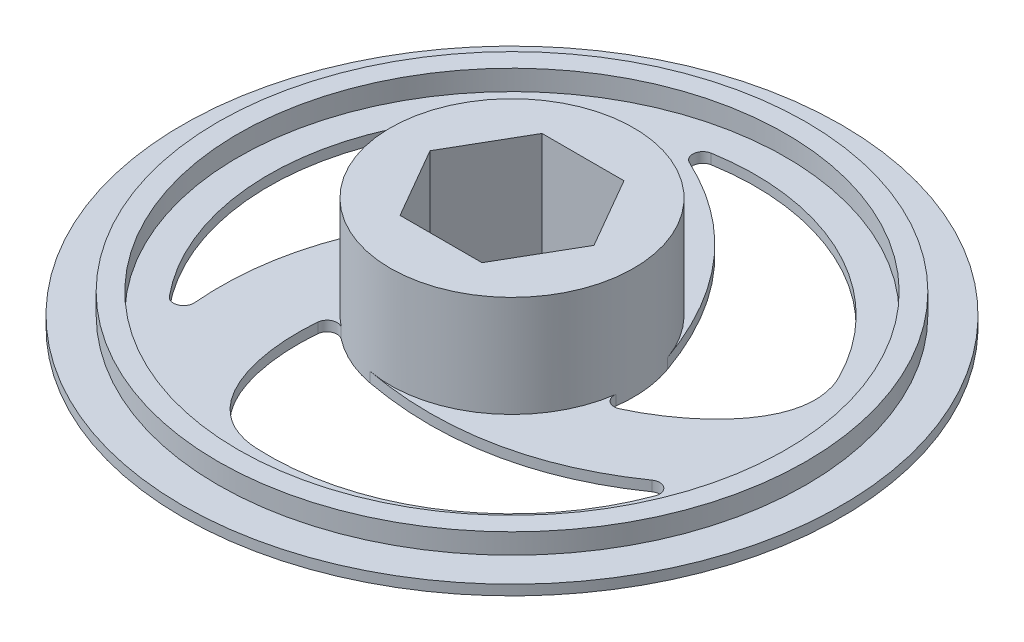
ISO-10303-21;
HEADER;
FILE_DESCRIPTION(('STEP AP214'),'2;1');
FILE_NAME('part.step','',(''),(''),'','','');
FILE_SCHEMA(('AUTOMOTIVE_DESIGN { 1 0 10303 214 1 1 1 1 }'));
ENDSEC;
DATA;
#1=APPLICATION_CONTEXT('core data for automotive mechanical design processes');
#2=APPLICATION_PROTOCOL_DEFINITION('international standard','automotive_design',2000,#1);
#3=PRODUCT_CONTEXT('',#1,'mechanical');
#4=PRODUCT('Part','Part','',(#3));
#5=PRODUCT_RELATED_PRODUCT_CATEGORY('part','',(#4));
#6=PRODUCT_DEFINITION_FORMATION('','',#4);
#7=PRODUCT_DEFINITION_CONTEXT('part definition',#1,'design');
#8=PRODUCT_DEFINITION('design','',#6,#7);
#9=PRODUCT_DEFINITION_SHAPE('','',#8);
#10=(LENGTH_UNIT() NAMED_UNIT(*) SI_UNIT(.MILLI.,.METRE.));
#11=(NAMED_UNIT(*) PLANE_ANGLE_UNIT() SI_UNIT($,.RADIAN.));
#12=(NAMED_UNIT(*) SI_UNIT($,.STERADIAN.) SOLID_ANGLE_UNIT());
#13=UNCERTAINTY_MEASURE_WITH_UNIT(LENGTH_MEASURE(1.E-05),#10,'distance_accuracy_value','');
#14=(GEOMETRIC_REPRESENTATION_CONTEXT(3) GLOBAL_UNCERTAINTY_ASSIGNED_CONTEXT((#13)) GLOBAL_UNIT_ASSIGNED_CONTEXT((#10,
#11,#12)) REPRESENTATION_CONTEXT('',''));
#15=CARTESIAN_POINT('',(0.,0.,0.));
#16=DIRECTION('',(0.,0.,1.));
#17=DIRECTION('',(1.,0.,0.));
#18=AXIS2_PLACEMENT_3D('',#15,#16,#17);
#19=CARTESIAN_POINT('',(0.,1.,0.));
#20=DIRECTION('',(0.,1.,0.));
#21=DIRECTION('',(0.,0.,1.));
#22=AXIS2_PLACEMENT_3D('',#19,#20,#21);
#23=PLANE('',#22);
#24=CARTESIAN_POINT('',(-8.69489343639183,1.,8.27035840395024));
#25=CARTESIAN_POINT('',(-9.77480690715076,1.,13.0736755082339));
#26=CARTESIAN_POINT('',(-8.87124438546541,1.,23.5659750834091));
#27=CARTESIAN_POINT('',(-1.26246524212837,1.,23.9667724467108));
#28=B_SPLINE_CURVE_WITH_KNOTS('',3,(#24,#25,#26,#27),.UNSPECIFIED.,.F.,.F.,(4,4),(0.,1.),.UNSPECIFIED.);
#29=CARTESIAN_POINT('',(-8.98473682398286,1.,10.1626556457353));
#30=VERTEX_POINT('',#29);
#31=CARTESIAN_POINT('',(-1.26246524212837,1.,23.9667724467108));
#32=VERTEX_POINT('',#31);
#33=EDGE_CURVE('E367',#30,#32,#28,.T.);
#34=ORIENTED_EDGE('',*,*,#33,.F.);
#35=CARTESIAN_POINT('',(-7.98905492211968,1.,10.2554864073508));
#36=DIRECTION('',(0.,1.,0.));
#37=DIRECTION('',(0.,0.,1.));
#38=AXIS2_PLACEMENT_3D('',#35,#36,#37);
#39=CIRCLE('',#38,1.);
#40=CARTESIAN_POINT('',(-7.37451223580273,1.,9.46660283755455));
#41=VERTEX_POINT('',#40);
#42=EDGE_CURVE('E420',#30,#41,#39,.F.);
#43=ORIENTED_EDGE('',*,*,#42,.T.);
#44=CARTESIAN_POINT('',(0.,1.,0.));
#45=DIRECTION('',(0.,1.,0.));
#46=DIRECTION('',(0.,0.,1.));
#47=AXIS2_PLACEMENT_3D('',#44,#45,#46);
#48=CIRCLE('',#47,12.);
#49=CARTESIAN_POINT('',(-9.12417481193198,1.,-7.79419232514223));
#50=VERTEX_POINT('',#49);
#51=EDGE_CURVE('E377',#50,#41,#48,.T.);
#52=ORIENTED_EDGE('',*,*,#51,.F.);
#53=CARTESIAN_POINT('',(-16.3192051709292,1.,17.5978277804142));
#54=CARTESIAN_POINT('',(-18.8195227349713,1.,3.55554676545661));
#55=CARTESIAN_POINT('',(-9.12417481193198,1.,-7.79419232514223));
#56=B_SPLINE_CURVE_WITH_KNOTS('',2,(#53,#54,#55),.UNSPECIFIED.,.F.,.F.,(3,3),(0.,1.),.UNSPECIFIED.);
#57=CARTESIAN_POINT('',(-16.7180312544519,1.,14.5843632732778));
#58=VERTEX_POINT('',#57);
#59=EDGE_CURVE('E446',#58,#50,#56,.T.);
#60=ORIENTED_EDGE('',*,*,#59,.F.);
#61=CARTESIAN_POINT('',(-17.7143817232309,1.,14.6697198393038));
#62=DIRECTION('',(0.,1.,0.));
#63=DIRECTION('',(0.,0.,1.));
#64=AXIS2_PLACEMENT_3D('',#61,#62,#63);
#65=CIRCLE('',#64,1.);
#66=CARTESIAN_POINT('',(-18.4845722329366,1.,15.3075337453605));
#67=VERTEX_POINT('',#66);
#68=EDGE_CURVE('E424',#58,#67,#65,.F.);
#69=ORIENTED_EDGE('',*,*,#68,.T.);
#70=CARTESIAN_POINT('',(0.,1.,0.));
#71=DIRECTION('',(0.,1.,0.));
#72=DIRECTION('',(0.,0.,1.));
#73=AXIS2_PLACEMENT_3D('',#70,#71,#72);
#74=CIRCLE('',#73,24.);
#75=CARTESIAN_POINT('',(-20.1246011645085,1.,-13.0767131944333));
#76=VERTEX_POINT('',#75);
#77=EDGE_CURVE('E483',#76,#67,#74,.T.);
#78=ORIENTED_EDGE('',*,*,#77,.F.);
#79=CARTESIAN_POINT('',(-0.580057571778099,1.,-11.9859723516043));
#80=CARTESIAN_POINT('',(-4.86743720434432,1.,-14.9036626374706));
#81=CARTESIAN_POINT('',(-15.696437734911,1.,-19.8915007933421));
#82=CARTESIAN_POINT('',(-20.1246011645085,1.,-13.0767131944333));
#83=B_SPLINE_CURVE_WITH_KNOTS('',3,(#79,#80,#81,#82),.UNSPECIFIED.,.F.,.F.,(4,4),(0.,1.),.UNSPECIFIED.);
#84=CARTESIAN_POINT('',(-2.95750387507128,1.,-13.4189966789089));
#85=VERTEX_POINT('',#84);
#86=EDGE_CURVE('E429',#85,#76,#83,.T.);
#87=ORIENTED_EDGE('',*,*,#86,.F.);
#88=CARTESIAN_POINT('',(-3.43206859081335,1.,-12.5387760641919));
#89=DIRECTION('',(0.,1.,0.));
#90=DIRECTION('',(0.,0.,1.));
#91=AXIS2_PLACEMENT_3D('',#88,#89,#90);
#92=CIRCLE('',#91,1.);
#93=CARTESIAN_POINT('',(-3.16806331459694,1.,-11.5742548284849));
#94=VERTEX_POINT('',#93);
#95=EDGE_CURVE('E47',#85,#94,#92,.F.);
#96=ORIENTED_EDGE('',*,*,#95,.T.);
#97=CARTESIAN_POINT('',(11.3120559615209,1.,-4.00467101313204));
#98=VERTEX_POINT('',#97);
#99=EDGE_CURVE('E373',#98,#94,#48,.T.);
#100=ORIENTED_EDGE('',*,*,#99,.F.);
#101=CARTESIAN_POINT('',(-7.08056332379757,1.,-22.9317601378022));
#102=CARTESIAN_POINT('',(6.33056754425671,1.,-18.0759581583122));
#103=CARTESIAN_POINT('',(11.3120559615209,1.,-4.00467101313204));
#104=B_SPLINE_CURVE_WITH_KNOTS('',2,(#101,#102,#103),.UNSPECIFIED.,.F.,.F.,(3,3),(0.,1.),.UNSPECIFIED.);
#105=CARTESIAN_POINT('',(-4.27141346545334,1.,-21.7704214042565));
#106=VERTEX_POINT('',#105);
#107=EDGE_CURVE('E218',#106,#98,#104,.T.);
#108=ORIENTED_EDGE('',*,*,#107,.F.);
#109=CARTESIAN_POINT('',(-3.84715918562212,1.,-22.6759645043047));
#110=DIRECTION('',(0.,1.,0.));
#111=DIRECTION('',(0.,0.,1.));
#112=AXIS2_PLACEMENT_3D('',#109,#110,#111);
#113=CIRCLE('',#112,1.);
#114=CARTESIAN_POINT('',(-4.01442697630134,1.,-23.6618760044918));
#115=VERTEX_POINT('',#114);
#116=EDGE_CURVE('E408',#106,#115,#113,.F.);
#117=ORIENTED_EDGE('',*,*,#116,.T.);
#118=CARTESIAN_POINT('',(0.,1.,0.));
#119=DIRECTION('',(0.,1.,0.));
#120=DIRECTION('',(0.,0.,1.));
#121=AXIS2_PLACEMENT_3D('',#118,#119,#120);
#122=CIRCLE('',#121,24.);
#123=CARTESIAN_POINT('',(21.3870664066367,1.,-10.8900592522775));
#124=VERTEX_POINT('',#123);
#125=EDGE_CURVE('E489',#124,#115,#122,.T.);
#126=ORIENTED_EDGE('',*,*,#125,.F.);
#127=CARTESIAN_POINT('',(11.509787194419,1.,3.39481939713872));
#128=CARTESIAN_POINT('',(16.2095385645404,1.,1.9283933445631));
#129=CARTESIAN_POINT('',(24.8443552799161,1.,-4.10026454071156));
#130=CARTESIAN_POINT('',(21.3870664066367,1.,-10.8900592522775));
#131=B_SPLINE_CURVE_WITH_KNOTS('',3,(#127,#128,#129,#130),.UNSPECIFIED.,.F.,.F.,(4,4),(0.,1.),.UNSPECIFIED.);
#132=CARTESIAN_POINT('',(13.2934863711115,1.,2.69968251301897));
#133=VERTEX_POINT('',#132);
#134=EDGE_CURVE('E463',#133,#124,#131,.T.);
#135=ORIENTED_EDGE('',*,*,#134,.F.);
#136=CARTESIAN_POINT('',(12.8760392179917,1.,1.79098131110928));
#137=DIRECTION('',(0.,1.,0.));
#138=DIRECTION('',(0.,0.,1.));
#139=AXIS2_PLACEMENT_3D('',#136,#137,#138);
#140=CIRCLE('',#139,1.);
#141=CARTESIAN_POINT('',(11.8855746627615,1.,1.65321351794702));
#142=VERTEX_POINT('',#141);
#143=EDGE_CURVE('E411',#133,#142,#140,.F.);
#144=ORIENTED_EDGE('',*,*,#143,.T.);
#145=CARTESIAN_POINT('',(-2.18788114958899,1.,11.7988633382743));
#146=VERTEX_POINT('',#145);
#147=EDGE_CURVE('E379',#146,#142,#48,.T.);
#148=ORIENTED_EDGE('',*,*,#147,.F.);
#149=CARTESIAN_POINT('',(23.3997684947268,1.,5.33393235738812));
#150=CARTESIAN_POINT('',(12.4889551907145,1.,14.5204113928557));
#151=CARTESIAN_POINT('',(-2.18788114958899,1.,11.7988633382743));
#152=B_SPLINE_CURVE_WITH_KNOTS('',2,(#149,#150,#151),.UNSPECIFIED.,.F.,.F.,(3,3),(0.,1.),.UNSPECIFIED.);
#153=CARTESIAN_POINT('',(20.9894447199052,1.,7.18605813097882));
#154=VERTEX_POINT('',#153);
#155=EDGE_CURVE('E470',#154,#146,#152,.T.);
#156=ORIENTED_EDGE('',*,*,#155,.F.);
#157=CARTESIAN_POINT('',(21.5615409088531,1.,8.00624466500103));
#158=DIRECTION('',(0.,1.,0.));
#159=DIRECTION('',(0.,0.,1.));
#160=AXIS2_PLACEMENT_3D('',#157,#158,#159);
#161=CIRCLE('',#160,1.);
#162=CARTESIAN_POINT('',(22.4989992092379,1.,8.3543422591315));
#163=VERTEX_POINT('',#162);
#164=EDGE_CURVE('E416',#154,#163,#161,.F.);
#165=ORIENTED_EDGE('',*,*,#164,.T.);
#166=CARTESIAN_POINT('',(0.,1.,0.));
#167=DIRECTION('',(0.,1.,0.));
#168=DIRECTION('',(0.,0.,1.));
#169=AXIS2_PLACEMENT_3D('',#166,#167,#168);
#170=CIRCLE('',#169,24.);
#171=EDGE_CURVE('E492',#32,#163,#170,.T.);
#172=ORIENTED_EDGE('',*,*,#171,.F.);
#173=EDGE_LOOP('',(#34,#43,#52,#60,#69,#78,#87,#96,#100,#108,#117,#126,#135,#144,#148,#156,#165,#172));
#174=FACE_BOUND('',#173,.T.);
#175=CARTESIAN_POINT('',(0.,1.,0.));
#176=DIRECTION('',(0.,1.,0.));
#177=DIRECTION('',(0.,0.,1.));
#178=AXIS2_PLACEMENT_3D('',#175,#176,#177);
#179=CIRCLE('',#178,27.);
#180=CARTESIAN_POINT('',(0.,1.,27.));
#181=VERTEX_POINT('',#180);
#182=EDGE_CURVE('E370',#181,#181,#179,.F.);
#183=ORIENTED_EDGE('',*,*,#182,.F.);
#184=EDGE_LOOP('',(#183));
#185=FACE_BOUND('',#184,.T.);
#186=ADVANCED_FACE('F39',(#174,#185),#23,.T.);
#187=CARTESIAN_POINT('',(0.,0.,0.));
#188=DIRECTION('',(0.,1.,0.));
#189=DIRECTION('',(0.,0.,1.));
#190=AXIS2_PLACEMENT_3D('',#187,#188,#189);
#191=PLANE('',#190);
#192=CARTESIAN_POINT('',(0.,0.,0.));
#193=DIRECTION('',(0.,-1.,0.));
#194=DIRECTION('',(0.,0.,1.));
#195=AXIS2_PLACEMENT_3D('',#192,#193,#194);
#196=CIRCLE('',#195,12.);
#197=CARTESIAN_POINT('',(-2.18788114958899,0.,11.7988633382743));
#198=VERTEX_POINT('',#197);
#199=CARTESIAN_POINT('',(-7.37451223580273,0.,9.46660283755455));
#200=VERTEX_POINT('',#199);
#201=EDGE_CURVE('E587',#198,#200,#196,.T.);
#202=ORIENTED_EDGE('',*,*,#201,.T.);
#203=CARTESIAN_POINT('',(-7.98905492211968,0.,10.2554864073508));
#204=DIRECTION('',(0.,1.,0.));
#205=DIRECTION('',(0.,0.,1.));
#206=AXIS2_PLACEMENT_3D('',#203,#204,#205);
#207=CIRCLE('',#206,1.);
#208=CARTESIAN_POINT('',(-8.98473682398286,0.,10.1626556457353));
#209=VERTEX_POINT('',#208);
#210=EDGE_CURVE('E422',#200,#209,#207,.T.);
#211=ORIENTED_EDGE('',*,*,#210,.T.);
#212=CARTESIAN_POINT('',(-8.69489343639183,0.,8.27035840395024));
#213=CARTESIAN_POINT('',(-9.77480690715076,0.,13.0736755082339));
#214=CARTESIAN_POINT('',(-8.87124438546541,0.,23.5659750834091));
#215=CARTESIAN_POINT('',(-1.26246524212837,0.,23.9667724467108));
#216=B_SPLINE_CURVE_WITH_KNOTS('',3,(#212,#213,#214,#215),.UNSPECIFIED.,.F.,.F.,(4,4),(0.,1.),.UNSPECIFIED.);
#217=CARTESIAN_POINT('',(-1.26246524212837,0.,23.9667724467108));
#218=VERTEX_POINT('',#217);
#219=EDGE_CURVE('E222',#209,#218,#216,.T.);
#220=ORIENTED_EDGE('',*,*,#219,.T.);
#221=CARTESIAN_POINT('',(0.,0.,0.));
#222=DIRECTION('',(0.,1.,0.));
#223=DIRECTION('',(0.,0.,1.));
#224=AXIS2_PLACEMENT_3D('',#221,#222,#223);
#225=CIRCLE('',#224,24.);
#226=CARTESIAN_POINT('',(22.4989992092379,0.,8.3543422591315));
#227=VERTEX_POINT('',#226);
#228=EDGE_CURVE('E258',#218,#227,#225,.T.);
#229=ORIENTED_EDGE('',*,*,#228,.T.);
#230=CARTESIAN_POINT('',(21.5615409088531,0.,8.00624466500103));
#231=DIRECTION('',(0.,1.,0.));
#232=DIRECTION('',(0.,0.,1.));
#233=AXIS2_PLACEMENT_3D('',#230,#231,#232);
#234=CIRCLE('',#233,1.);
#235=CARTESIAN_POINT('',(20.9894447199052,0.,7.18605813097882));
#236=VERTEX_POINT('',#235);
#237=EDGE_CURVE('E418',#227,#236,#234,.T.);
#238=ORIENTED_EDGE('',*,*,#237,.T.);
#239=CARTESIAN_POINT('',(23.3997684947268,0.,5.33393235738812));
#240=CARTESIAN_POINT('',(12.4889551907145,0.,14.5204113928557));
#241=CARTESIAN_POINT('',(-2.18788114958899,0.,11.7988633382743));
#242=B_SPLINE_CURVE_WITH_KNOTS('',2,(#239,#240,#241),.UNSPECIFIED.,.F.,.F.,(3,3),(0.,1.),.UNSPECIFIED.);
#243=EDGE_CURVE('E596',#236,#198,#242,.T.);
#244=ORIENTED_EDGE('',*,*,#243,.T.);
#245=EDGE_LOOP('',(#202,#211,#220,#229,#238,#244));
#246=FACE_BOUND('',#245,.T.);
#247=CARTESIAN_POINT('',(0.,0.,0.));
#248=DIRECTION('',(0.,-1.,0.));
#249=DIRECTION('',(0.,0.,1.));
#250=AXIS2_PLACEMENT_3D('',#247,#248,#249);
#251=CIRCLE('',#250,12.);
#252=CARTESIAN_POINT('',(11.3120559615209,0.,-4.00467101313204));
#253=VERTEX_POINT('',#252);
#254=CARTESIAN_POINT('',(11.8855746627615,0.,1.65321351794702));
#255=VERTEX_POINT('',#254);
#256=EDGE_CURVE('E204',#253,#255,#251,.T.);
#257=ORIENTED_EDGE('',*,*,#256,.T.);
#258=CARTESIAN_POINT('',(12.8760392179917,0.,1.79098131110928));
#259=DIRECTION('',(0.,1.,0.));
#260=DIRECTION('',(0.,0.,1.));
#261=AXIS2_PLACEMENT_3D('',#258,#259,#260);
#262=CIRCLE('',#261,1.);
#263=CARTESIAN_POINT('',(13.2934863711115,0.,2.69968251301897));
#264=VERTEX_POINT('',#263);
#265=EDGE_CURVE('E414',#255,#264,#262,.T.);
#266=ORIENTED_EDGE('',*,*,#265,.T.);
#267=CARTESIAN_POINT('',(11.509787194419,0.,3.39481939713872));
#268=CARTESIAN_POINT('',(16.2095385645404,0.,1.9283933445631));
#269=CARTESIAN_POINT('',(24.8443552799161,0.,-4.10026454071156));
#270=CARTESIAN_POINT('',(21.3870664066367,0.,-10.8900592522775));
#271=B_SPLINE_CURVE_WITH_KNOTS('',3,(#267,#268,#269,#270),.UNSPECIFIED.,.F.,.F.,(4,4),(0.,1.),.UNSPECIFIED.);
#272=CARTESIAN_POINT('',(21.3870664066367,0.,-10.8900592522775));
#273=VERTEX_POINT('',#272);
#274=EDGE_CURVE('E269',#264,#273,#271,.T.);
#275=ORIENTED_EDGE('',*,*,#274,.T.);
#276=CARTESIAN_POINT('',(0.,0.,0.));
#277=DIRECTION('',(0.,1.,0.));
#278=DIRECTION('',(0.,0.,1.));
#279=AXIS2_PLACEMENT_3D('',#276,#277,#278);
#280=CIRCLE('',#279,24.);
#281=CARTESIAN_POINT('',(-4.01442697630134,0.,-23.6618760044918));
#282=VERTEX_POINT('',#281);
#283=EDGE_CURVE('E212',#273,#282,#280,.T.);
#284=ORIENTED_EDGE('',*,*,#283,.T.);
#285=CARTESIAN_POINT('',(-3.84715918562212,0.,-22.6759645043047));
#286=DIRECTION('',(0.,1.,0.));
#287=DIRECTION('',(0.,0.,1.));
#288=AXIS2_PLACEMENT_3D('',#285,#286,#287);
#289=CIRCLE('',#288,1.);
#290=CARTESIAN_POINT('',(-4.27141346545334,0.,-21.7704214042565));
#291=VERTEX_POINT('',#290);
#292=EDGE_CURVE('E208',#282,#291,#289,.T.);
#293=ORIENTED_EDGE('',*,*,#292,.T.);
#294=CARTESIAN_POINT('',(-7.08056332379757,0.,-22.9317601378022));
#295=CARTESIAN_POINT('',(6.33056754425671,0.,-18.0759581583122));
#296=CARTESIAN_POINT('',(11.3120559615209,0.,-4.00467101313204));
#297=B_SPLINE_CURVE_WITH_KNOTS('',2,(#294,#295,#296),.UNSPECIFIED.,.F.,.F.,(3,3),(0.,1.),.UNSPECIFIED.);
#298=EDGE_CURVE('E200',#291,#253,#297,.T.);
#299=ORIENTED_EDGE('',*,*,#298,.T.);
#300=EDGE_LOOP('',(#257,#266,#275,#284,#293,#299));
#301=FACE_BOUND('',#300,.T.);
#302=CARTESIAN_POINT('',(0.,0.,0.));
#303=DIRECTION('',(0.,-1.,0.));
#304=DIRECTION('',(0.,0.,1.));
#305=AXIS2_PLACEMENT_3D('',#302,#303,#304);
#306=CIRCLE('',#305,12.);
#307=CARTESIAN_POINT('',(-9.12417481193198,0.,-7.79419232514223));
#308=VERTEX_POINT('',#307);
#309=CARTESIAN_POINT('',(-3.16806331459694,0.,-11.5742548284849));
#310=VERTEX_POINT('',#309);
#311=EDGE_CURVE('E432',#308,#310,#306,.T.);
#312=ORIENTED_EDGE('',*,*,#311,.T.);
#313=CARTESIAN_POINT('',(-3.43206859081335,0.,-12.5387760641919));
#314=DIRECTION('',(0.,1.,0.));
#315=DIRECTION('',(0.,0.,1.));
#316=AXIS2_PLACEMENT_3D('',#313,#314,#315);
#317=CIRCLE('',#316,1.);
#318=CARTESIAN_POINT('',(-2.95750387507128,0.,-13.4189966789089));
#319=VERTEX_POINT('',#318);
#320=EDGE_CURVE('E11',#310,#319,#317,.T.);
#321=ORIENTED_EDGE('',*,*,#320,.T.);
#322=CARTESIAN_POINT('',(-0.580057571778099,0.,-11.9859723516043));
#323=CARTESIAN_POINT('',(-4.86743720434432,0.,-14.9036626374706));
#324=CARTESIAN_POINT('',(-15.696437734911,0.,-19.8915007933421));
#325=CARTESIAN_POINT('',(-20.1246011645085,0.,-13.0767131944333));
#326=B_SPLINE_CURVE_WITH_KNOTS('',3,(#322,#323,#324,#325),.UNSPECIFIED.,.F.,.F.,(4,4),(0.,1.),.UNSPECIFIED.);
#327=CARTESIAN_POINT('',(-20.1246011645085,0.,-13.0767131944333));
#328=VERTEX_POINT('',#327);
#329=EDGE_CURVE('E260',#319,#328,#326,.T.);
#330=ORIENTED_EDGE('',*,*,#329,.T.);
#331=CARTESIAN_POINT('',(0.,0.,0.));
#332=DIRECTION('',(0.,1.,0.));
#333=DIRECTION('',(0.,0.,1.));
#334=AXIS2_PLACEMENT_3D('',#331,#332,#333);
#335=CIRCLE('',#334,24.);
#336=CARTESIAN_POINT('',(-18.4845722329366,0.,15.3075337453605));
#337=VERTEX_POINT('',#336);
#338=EDGE_CURVE('E268',#328,#337,#335,.T.);
#339=ORIENTED_EDGE('',*,*,#338,.T.);
#340=CARTESIAN_POINT('',(-17.7143817232309,0.,14.6697198393038));
#341=DIRECTION('',(0.,1.,0.));
#342=DIRECTION('',(0.,0.,1.));
#343=AXIS2_PLACEMENT_3D('',#340,#341,#342);
#344=CIRCLE('',#343,1.);
#345=CARTESIAN_POINT('',(-16.7180312544519,0.,14.5843632732778));
#346=VERTEX_POINT('',#345);
#347=EDGE_CURVE('E426',#337,#346,#344,.T.);
#348=ORIENTED_EDGE('',*,*,#347,.T.);
#349=CARTESIAN_POINT('',(-16.3192051709292,0.,17.5978277804142));
#350=CARTESIAN_POINT('',(-18.8195227349713,0.,3.55554676545661));
#351=CARTESIAN_POINT('',(-9.12417481193198,0.,-7.79419232514223));
#352=B_SPLINE_CURVE_WITH_KNOTS('',2,(#349,#350,#351),.UNSPECIFIED.,.F.,.F.,(3,3),(0.,1.),.UNSPECIFIED.);
#353=EDGE_CURVE('E435',#346,#308,#352,.T.);
#354=ORIENTED_EDGE('',*,*,#353,.T.);
#355=EDGE_LOOP('',(#312,#321,#330,#339,#348,#354));
#356=FACE_BOUND('',#355,.T.);
#357=CARTESIAN_POINT('',(0.,0.,0.));
#358=DIRECTION('',(0.,1.,0.));
#359=DIRECTION('',(0.,0.,1.));
#360=AXIS2_PLACEMENT_3D('',#357,#358,#359);
#361=CIRCLE('',#360,32.5);
#362=CARTESIAN_POINT('',(0.,0.,32.5));
#363=VERTEX_POINT('',#362);
#364=EDGE_CURVE('E381',#363,#363,#361,.T.);
#365=ORIENTED_EDGE('',*,*,#364,.F.);
#366=EDGE_LOOP('',(#365));
#367=FACE_BOUND('',#366,.T.);
#368=DIRECTION('',(-1.,0.,0.));
#369=VECTOR('',#368,1.);
#370=CARTESIAN_POINT('',(0.,0.,7.));
#371=LINE('',#370,#369);
#372=CARTESIAN_POINT('',(4.04145188432738,0.,7.));
#373=VERTEX_POINT('',#372);
#374=CARTESIAN_POINT('',(-4.04145188432739,0.,7.));
#375=VERTEX_POINT('',#374);
#376=EDGE_CURVE('E544',#373,#375,#371,.T.);
#377=ORIENTED_EDGE('',*,*,#376,.F.);
#378=DIRECTION('',(-0.5,0.,0.866025403784439));
#379=VECTOR('',#378,1.);
#380=CARTESIAN_POINT('',(6.06217782649107,0.,3.5));
#381=LINE('',#380,#379);
#382=CARTESIAN_POINT('',(8.08290376865476,0.,0.));
#383=VERTEX_POINT('',#382);
#384=EDGE_CURVE('E542',#383,#373,#381,.T.);
#385=ORIENTED_EDGE('',*,*,#384,.F.);
#386=DIRECTION('',(0.5,0.,0.866025403784439));
#387=VECTOR('',#386,1.);
#388=CARTESIAN_POINT('',(6.06217782649107,0.,-3.5));
#389=LINE('',#388,#387);
#390=CARTESIAN_POINT('',(4.04145188432738,0.,-7.));
#391=VERTEX_POINT('',#390);
#392=EDGE_CURVE('E540',#391,#383,#389,.T.);
#393=ORIENTED_EDGE('',*,*,#392,.F.);
#394=DIRECTION('',(1.,0.,0.));
#395=VECTOR('',#394,1.);
#396=CARTESIAN_POINT('',(0.,0.,-7.));
#397=LINE('',#396,#395);
#398=CARTESIAN_POINT('',(-4.04145188432738,0.,-7.));
#399=VERTEX_POINT('',#398);
#400=EDGE_CURVE('E538',#399,#391,#397,.T.);
#401=ORIENTED_EDGE('',*,*,#400,.F.);
#402=DIRECTION('',(0.5,0.,-0.866025403784439));
#403=VECTOR('',#402,1.);
#404=CARTESIAN_POINT('',(-6.06217782649107,0.,-3.5));
#405=LINE('',#404,#403);
#406=CARTESIAN_POINT('',(-8.08290376865476,0.,0.));
#407=VERTEX_POINT('',#406);
#408=EDGE_CURVE('E536',#407,#399,#405,.T.);
#409=ORIENTED_EDGE('',*,*,#408,.F.);
#410=DIRECTION('',(-0.5,0.,-0.866025403784439));
#411=VECTOR('',#410,1.);
#412=CARTESIAN_POINT('',(-6.06217782649107,0.,3.5));
#413=LINE('',#412,#411);
#414=EDGE_CURVE('E534',#375,#407,#413,.T.);
#415=ORIENTED_EDGE('',*,*,#414,.F.);
#416=EDGE_LOOP('',(#377,#385,#393,#401,#409,#415));
#417=FACE_BOUND('',#416,.T.);
#418=ADVANCED_FACE('F202',(#246,#301,#356,#367,#417),#191,.F.);
#419=CARTESIAN_POINT('',(0.,11.,0.));
#420=DIRECTION('',(0.,1.,0.));
#421=DIRECTION('',(0.,0.,1.));
#422=AXIS2_PLACEMENT_3D('',#419,#420,#421);
#423=PLANE('',#422);
#424=CARTESIAN_POINT('',(0.,11.,0.));
#425=DIRECTION('',(0.,1.,0.));
#426=DIRECTION('',(0.,0.,1.));
#427=AXIS2_PLACEMENT_3D('',#424,#425,#426);
#428=CIRCLE('',#427,12.);
#429=CARTESIAN_POINT('',(0.,11.,12.));
#430=VERTEX_POINT('',#429);
#431=EDGE_CURVE('E547',#430,#430,#428,.T.);
#432=ORIENTED_EDGE('',*,*,#431,.T.);
#433=EDGE_LOOP('',(#432));
#434=FACE_BOUND('',#433,.T.);
#435=DIRECTION('',(0.5,0.,-0.866025403784439));
#436=VECTOR('',#435,1.);
#437=CARTESIAN_POINT('',(4.04145188432738,11.,7.));
#438=LINE('',#437,#436);
#439=CARTESIAN_POINT('',(4.04145188432738,11.,7.));
#440=VERTEX_POINT('',#439);
#441=CARTESIAN_POINT('',(8.08290376865476,11.,0.));
#442=VERTEX_POINT('',#441);
#443=EDGE_CURVE('E506',#440,#442,#438,.T.);
#444=ORIENTED_EDGE('',*,*,#443,.F.);
#445=DIRECTION('',(1.,0.,0.));
#446=VECTOR('',#445,1.);
#447=CARTESIAN_POINT('',(-4.04145188432738,11.,7.));
#448=LINE('',#447,#446);
#449=CARTESIAN_POINT('',(-4.04145188432738,11.,7.));
#450=VERTEX_POINT('',#449);
#451=EDGE_CURVE('E502',#450,#440,#448,.T.);
#452=ORIENTED_EDGE('',*,*,#451,.F.);
#453=DIRECTION('',(0.5,0.,0.866025403784439));
#454=VECTOR('',#453,1.);
#455=CARTESIAN_POINT('',(-8.08290376865476,11.,0.));
#456=LINE('',#455,#454);
#457=CARTESIAN_POINT('',(-8.08290376865476,11.,0.));
#458=VERTEX_POINT('',#457);
#459=EDGE_CURVE('E515',#458,#450,#456,.T.);
#460=ORIENTED_EDGE('',*,*,#459,.F.);
#461=DIRECTION('',(-0.5,0.,0.866025403784439));
#462=VECTOR('',#461,1.);
#463=CARTESIAN_POINT('',(-4.04145188432738,11.,-7.));
#464=LINE('',#463,#462);
#465=CARTESIAN_POINT('',(-4.04145188432738,11.,-7.));
#466=VERTEX_POINT('',#465);
#467=EDGE_CURVE('E512',#466,#458,#464,.T.);
#468=ORIENTED_EDGE('',*,*,#467,.F.);
#469=DIRECTION('',(-1.,0.,0.));
#470=VECTOR('',#469,1.);
#471=CARTESIAN_POINT('',(4.04145188432738,11.,-7.));
#472=LINE('',#471,#470);
#473=CARTESIAN_POINT('',(4.04145188432738,11.,-7.));
#474=VERTEX_POINT('',#473);
#475=EDGE_CURVE('E510',#474,#466,#472,.T.);
#476=ORIENTED_EDGE('',*,*,#475,.F.);
#477=DIRECTION('',(-0.5,0.,-0.866025403784439));
#478=VECTOR('',#477,1.);
#479=CARTESIAN_POINT('',(8.08290376865476,11.,0.));
#480=LINE('',#479,#478);
#481=EDGE_CURVE('E508',#442,#474,#480,.T.);
#482=ORIENTED_EDGE('',*,*,#481,.F.);
#483=EDGE_LOOP('',(#444,#452,#460,#468,#476,#482));
#484=FACE_BOUND('',#483,.T.);
#485=ADVANCED_FACE('F319',(#434,#484),#423,.T.);
#486=CARTESIAN_POINT('',(0.,1.,0.));
#487=DIRECTION('',(0.,-1.,0.));
#488=DIRECTION('',(0.,0.,-1.));
#489=AXIS2_PLACEMENT_3D('',#486,#487,#488);
#490=CYLINDRICAL_SURFACE('',#489,32.5);
#491=CARTESIAN_POINT('',(0.,1.,0.));
#492=DIRECTION('',(0.,1.,0.));
#493=DIRECTION('',(0.,0.,1.));
#494=AXIS2_PLACEMENT_3D('',#491,#492,#493);
#495=CIRCLE('',#494,32.5);
#496=CARTESIAN_POINT('',(0.,1.,32.5));
#497=VERTEX_POINT('',#496);
#498=EDGE_CURVE('E549',#497,#497,#495,.T.);
#499=ORIENTED_EDGE('',*,*,#498,.F.);
#500=EDGE_LOOP('',(#499));
#501=FACE_BOUND('',#500,.T.);
#502=ORIENTED_EDGE('',*,*,#364,.T.);
#503=EDGE_LOOP('',(#502));
#504=FACE_BOUND('',#503,.T.);
#505=ADVANCED_FACE('F322',(#501,#504),#490,.T.);
#506=CARTESIAN_POINT('',(0.,1.,0.));
#507=DIRECTION('',(0.,1.,0.));
#508=DIRECTION('',(0.,0.,1.));
#509=AXIS2_PLACEMENT_3D('',#506,#507,#508);
#510=CIRCLE('',#509,29.);
#511=CARTESIAN_POINT('',(0.,1.,29.));
#512=VERTEX_POINT('',#511);
#513=EDGE_CURVE('E498',#512,#512,#510,.T.);
#514=ORIENTED_EDGE('',*,*,#513,.F.);
#515=EDGE_LOOP('',(#514));
#516=FACE_BOUND('',#515,.T.);
#517=ORIENTED_EDGE('',*,*,#498,.T.);
#518=EDGE_LOOP('',(#517));
#519=FACE_BOUND('',#518,.T.);
#520=ADVANCED_FACE('F326',(#516,#519),#23,.T.);
#521=CARTESIAN_POINT('',(0.,11.,0.));
#522=DIRECTION('',(0.,-1.,0.));
#523=DIRECTION('',(0.,0.,-1.));
#524=AXIS2_PLACEMENT_3D('',#521,#522,#523);
#525=CYLINDRICAL_SURFACE('',#524,12.);
#526=ORIENTED_EDGE('',*,*,#431,.F.);
#527=EDGE_LOOP('',(#526));
#528=FACE_BOUND('',#527,.T.);
#529=ORIENTED_EDGE('',*,*,#147,.T.);
#530=DIRECTION('',(0.,-1.,0.));
#531=VECTOR('',#530,1.);
#532=CARTESIAN_POINT('',(11.8855746627615,11.,1.65321351794702));
#533=LINE('',#532,#531);
#534=EDGE_CURVE('E226',#142,#255,#533,.T.);
#535=ORIENTED_EDGE('',*,*,#534,.T.);
#536=ORIENTED_EDGE('',*,*,#256,.F.);
#537=DIRECTION('',(0.,1.,0.));
#538=VECTOR('',#537,1.);
#539=CARTESIAN_POINT('',(11.3120559615209,0.,-4.00467101313204));
#540=LINE('',#539,#538);
#541=EDGE_CURVE('E215',#253,#98,#540,.T.);
#542=ORIENTED_EDGE('',*,*,#541,.T.);
#543=ORIENTED_EDGE('',*,*,#99,.T.);
#544=DIRECTION('',(0.,-1.,0.));
#545=VECTOR('',#544,1.);
#546=CARTESIAN_POINT('',(-3.16806331459694,11.,-11.5742548284849));
#547=LINE('',#546,#545);
#548=EDGE_CURVE('E388',#94,#310,#547,.T.);
#549=ORIENTED_EDGE('',*,*,#548,.T.);
#550=ORIENTED_EDGE('',*,*,#311,.F.);
#551=DIRECTION('',(0.,1.,0.));
#552=VECTOR('',#551,1.);
#553=CARTESIAN_POINT('',(-9.12417481193198,0.,-7.79419232514223));
#554=LINE('',#553,#552);
#555=EDGE_CURVE('E440',#308,#50,#554,.T.);
#556=ORIENTED_EDGE('',*,*,#555,.T.);
#557=ORIENTED_EDGE('',*,*,#51,.T.);
#558=DIRECTION('',(0.,-1.,0.));
#559=VECTOR('',#558,1.);
#560=CARTESIAN_POINT('',(-7.37451223580273,11.,9.46660283755455));
#561=LINE('',#560,#559);
#562=EDGE_CURVE('E390',#41,#200,#561,.T.);
#563=ORIENTED_EDGE('',*,*,#562,.T.);
#564=ORIENTED_EDGE('',*,*,#201,.F.);
#565=DIRECTION('',(0.,1.,0.));
#566=VECTOR('',#565,1.);
#567=CARTESIAN_POINT('',(-2.18788114958899,0.,11.7988633382743));
#568=LINE('',#567,#566);
#569=EDGE_CURVE('E592',#198,#146,#568,.T.);
#570=ORIENTED_EDGE('',*,*,#569,.T.);
#571=EDGE_LOOP('',(#529,#535,#536,#542,#543,#549,#550,#556,#557,#563,#564,#570));
#572=FACE_BOUND('',#571,.T.);
#573=ADVANCED_FACE('F224',(#528,#572),#525,.T.);
#574=CARTESIAN_POINT('',(-4.04145188432738,11.,7.));
#575=DIRECTION('',(0.,0.,-1.));
#576=DIRECTION('',(-1.,0.,0.));
#577=AXIS2_PLACEMENT_3D('',#574,#575,#576);
#578=PLANE('',#577);
#579=ORIENTED_EDGE('',*,*,#376,.T.);
#580=DIRECTION('',(0.,-1.,0.));
#581=VECTOR('',#580,1.);
#582=CARTESIAN_POINT('',(-4.04145188432738,11.,7.));
#583=LINE('',#582,#581);
#584=EDGE_CURVE('E517',#450,#375,#583,.T.);
#585=ORIENTED_EDGE('',*,*,#584,.F.);
#586=ORIENTED_EDGE('',*,*,#451,.T.);
#587=DIRECTION('',(0.,-1.,0.));
#588=VECTOR('',#587,1.);
#589=CARTESIAN_POINT('',(4.04145188432738,11.,7.));
#590=LINE('',#589,#588);
#591=EDGE_CURVE('E531',#440,#373,#590,.T.);
#592=ORIENTED_EDGE('',*,*,#591,.T.);
#593=EDGE_LOOP('',(#579,#585,#586,#592));
#594=FACE_BOUND('',#593,.T.);
#595=ADVANCED_FACE('F314',(#594),#578,.T.);
#596=CARTESIAN_POINT('',(4.04145188432738,11.,7.));
#597=DIRECTION('',(-0.866025403784439,0.,-0.5));
#598=DIRECTION('',(-0.5,0.,0.866025403784439));
#599=AXIS2_PLACEMENT_3D('',#596,#597,#598);
#600=PLANE('',#599);
#601=ORIENTED_EDGE('',*,*,#384,.T.);
#602=ORIENTED_EDGE('',*,*,#591,.F.);
#603=ORIENTED_EDGE('',*,*,#443,.T.);
#604=DIRECTION('',(0.,-1.,0.));
#605=VECTOR('',#604,1.);
#606=CARTESIAN_POINT('',(8.08290376865476,11.,0.));
#607=LINE('',#606,#605);
#608=EDGE_CURVE('E528',#442,#383,#607,.T.);
#609=ORIENTED_EDGE('',*,*,#608,.T.);
#610=EDGE_LOOP('',(#601,#602,#603,#609));
#611=FACE_BOUND('',#610,.T.);
#612=ADVANCED_FACE('F310',(#611),#600,.T.);
#613=CARTESIAN_POINT('',(8.08290376865476,11.,0.));
#614=DIRECTION('',(-0.866025403784439,0.,0.5));
#615=DIRECTION('',(0.5,0.,0.866025403784439));
#616=AXIS2_PLACEMENT_3D('',#613,#614,#615);
#617=PLANE('',#616);
#618=ORIENTED_EDGE('',*,*,#392,.T.);
#619=ORIENTED_EDGE('',*,*,#608,.F.);
#620=ORIENTED_EDGE('',*,*,#481,.T.);
#621=DIRECTION('',(0.,-1.,0.));
#622=VECTOR('',#621,1.);
#623=CARTESIAN_POINT('',(4.04145188432738,11.,-7.));
#624=LINE('',#623,#622);
#625=EDGE_CURVE('E525',#474,#391,#624,.T.);
#626=ORIENTED_EDGE('',*,*,#625,.T.);
#627=EDGE_LOOP('',(#618,#619,#620,#626));
#628=FACE_BOUND('',#627,.T.);
#629=ADVANCED_FACE('F306',(#628),#617,.T.);
#630=CARTESIAN_POINT('',(4.04145188432738,11.,-7.));
#631=DIRECTION('',(0.,0.,1.));
#632=DIRECTION('',(1.,0.,0.));
#633=AXIS2_PLACEMENT_3D('',#630,#631,#632);
#634=PLANE('',#633);
#635=ORIENTED_EDGE('',*,*,#400,.T.);
#636=ORIENTED_EDGE('',*,*,#625,.F.);
#637=ORIENTED_EDGE('',*,*,#475,.T.);
#638=DIRECTION('',(0.,-1.,0.));
#639=VECTOR('',#638,1.);
#640=CARTESIAN_POINT('',(-4.04145188432738,11.,-7.));
#641=LINE('',#640,#639);
#642=EDGE_CURVE('E522',#466,#399,#641,.T.);
#643=ORIENTED_EDGE('',*,*,#642,.T.);
#644=EDGE_LOOP('',(#635,#636,#637,#643));
#645=FACE_BOUND('',#644,.T.);
#646=ADVANCED_FACE('F302',(#645),#634,.T.);
#647=CARTESIAN_POINT('',(-4.04145188432738,11.,-7.));
#648=DIRECTION('',(0.866025403784439,0.,0.5));
#649=DIRECTION('',(0.5,0.,-0.866025403784439));
#650=AXIS2_PLACEMENT_3D('',#647,#648,#649);
#651=PLANE('',#650);
#652=ORIENTED_EDGE('',*,*,#408,.T.);
#653=ORIENTED_EDGE('',*,*,#642,.F.);
#654=ORIENTED_EDGE('',*,*,#467,.T.);
#655=DIRECTION('',(0.,-1.,0.));
#656=VECTOR('',#655,1.);
#657=CARTESIAN_POINT('',(-8.08290376865476,11.,0.));
#658=LINE('',#657,#656);
#659=EDGE_CURVE('E519',#458,#407,#658,.T.);
#660=ORIENTED_EDGE('',*,*,#659,.T.);
#661=EDGE_LOOP('',(#652,#653,#654,#660));
#662=FACE_BOUND('',#661,.T.);
#663=ADVANCED_FACE('F298',(#662),#651,.T.);
#664=CARTESIAN_POINT('',(-8.08290376865476,11.,0.));
#665=DIRECTION('',(0.866025403784439,0.,-0.5));
#666=DIRECTION('',(-0.5,0.,-0.866025403784439));
#667=AXIS2_PLACEMENT_3D('',#664,#665,#666);
#668=PLANE('',#667);
#669=ORIENTED_EDGE('',*,*,#414,.T.);
#670=ORIENTED_EDGE('',*,*,#659,.F.);
#671=ORIENTED_EDGE('',*,*,#459,.T.);
#672=ORIENTED_EDGE('',*,*,#584,.T.);
#673=EDGE_LOOP('',(#669,#670,#671,#672));
#674=FACE_BOUND('',#673,.T.);
#675=ADVANCED_FACE('F291',(#674),#668,.T.);
#676=CARTESIAN_POINT('',(0.,3.,0.));
#677=DIRECTION('',(0.,1.,0.));
#678=DIRECTION('',(0.,0.,1.));
#679=AXIS2_PLACEMENT_3D('',#676,#677,#678);
#680=PLANE('',#679);
#681=CARTESIAN_POINT('',(0.,3.,0.));
#682=DIRECTION('',(0.,1.,0.));
#683=DIRECTION('',(0.,0.,1.));
#684=AXIS2_PLACEMENT_3D('',#681,#682,#683);
#685=CIRCLE('',#684,29.);
#686=CARTESIAN_POINT('',(0.,3.,29.));
#687=VERTEX_POINT('',#686);
#688=EDGE_CURVE('E499',#687,#687,#685,.T.);
#689=ORIENTED_EDGE('',*,*,#688,.T.);
#690=EDGE_LOOP('',(#689));
#691=FACE_BOUND('',#690,.T.);
#692=CARTESIAN_POINT('',(0.,3.,0.));
#693=DIRECTION('',(0.,1.,0.));
#694=DIRECTION('',(0.,0.,1.));
#695=AXIS2_PLACEMENT_3D('',#692,#693,#694);
#696=CIRCLE('',#695,27.);
#697=CARTESIAN_POINT('',(0.,3.,27.));
#698=VERTEX_POINT('',#697);
#699=EDGE_CURVE('E495',#698,#698,#696,.T.);
#700=ORIENTED_EDGE('',*,*,#699,.F.);
#701=EDGE_LOOP('',(#700));
#702=FACE_BOUND('',#701,.T.);
#703=ADVANCED_FACE('F288',(#691,#702),#680,.T.);
#704=CARTESIAN_POINT('',(0.,3.,0.));
#705=DIRECTION('',(0.,-1.,0.));
#706=DIRECTION('',(0.,0.,-1.));
#707=AXIS2_PLACEMENT_3D('',#704,#705,#706);
#708=CYLINDRICAL_SURFACE('',#707,29.);
#709=ORIENTED_EDGE('',*,*,#688,.F.);
#710=EDGE_LOOP('',(#709));
#711=FACE_BOUND('',#710,.T.);
#712=ORIENTED_EDGE('',*,*,#513,.T.);
#713=EDGE_LOOP('',(#712));
#714=FACE_BOUND('',#713,.T.);
#715=ADVANCED_FACE('F286',(#711,#714),#708,.T.);
#716=CARTESIAN_POINT('',(0.,3.,0.));
#717=DIRECTION('',(0.,-1.,0.));
#718=DIRECTION('',(0.,0.,-1.));
#719=AXIS2_PLACEMENT_3D('',#716,#717,#718);
#720=CYLINDRICAL_SURFACE('',#719,27.);
#721=ORIENTED_EDGE('',*,*,#699,.T.);
#722=EDGE_LOOP('',(#721));
#723=FACE_BOUND('',#722,.T.);
#724=ORIENTED_EDGE('',*,*,#182,.T.);
#725=EDGE_LOOP('',(#724));
#726=FACE_BOUND('',#725,.T.);
#727=ADVANCED_FACE('F280',(#723,#726),#720,.F.);
#728=DIRECTION('',(0.,1.,0.));
#729=VECTOR('',#728,1.);
#730=SURFACE_OF_LINEAR_EXTRUSION('',#326,#729);
#731=ORIENTED_EDGE('',*,*,#329,.F.);
#732=DIRECTION('',(0.,1.,0.));
#733=VECTOR('',#732,1.);
#734=CARTESIAN_POINT('',(-2.95750387507125,0.,-13.4189966789088));
#735=LINE('',#734,#733);
#736=EDGE_CURVE('E406',#319,#85,#735,.T.);
#737=ORIENTED_EDGE('',*,*,#736,.T.);
#738=ORIENTED_EDGE('',*,*,#86,.T.);
#739=DIRECTION('',(0.,1.,0.));
#740=VECTOR('',#739,1.);
#741=CARTESIAN_POINT('',(-20.1246011645085,0.,-13.0767131944333));
#742=LINE('',#741,#740);
#743=EDGE_CURVE('E437',#328,#76,#742,.T.);
#744=ORIENTED_EDGE('',*,*,#743,.F.);
#745=EDGE_LOOP('',(#731,#737,#738,#744));
#746=FACE_BOUND('',#745,.T.);
#747=ADVANCED_FACE('F275',(#746),#730,.F.);
#748=DIRECTION('',(0.,1.,0.));
#749=VECTOR('',#748,1.);
#750=SURFACE_OF_LINEAR_EXTRUSION('',#352,#749);
#751=ORIENTED_EDGE('',*,*,#353,.F.);
#752=DIRECTION('',(0.,1.,0.));
#753=VECTOR('',#752,1.);
#754=CARTESIAN_POINT('',(-16.7180312544519,0.,14.5843632732778));
#755=LINE('',#754,#753);
#756=EDGE_CURVE('E401',#346,#58,#755,.T.);
#757=ORIENTED_EDGE('',*,*,#756,.T.);
#758=ORIENTED_EDGE('',*,*,#59,.T.);
#759=ORIENTED_EDGE('',*,*,#555,.F.);
#760=EDGE_LOOP('',(#751,#757,#758,#759));
#761=FACE_BOUND('',#760,.T.);
#762=ADVANCED_FACE('F279',(#761),#750,.F.);
#763=CARTESIAN_POINT('',(0.,0.,0.));
#764=DIRECTION('',(0.,1.,0.));
#765=DIRECTION('',(0.,0.,1.));
#766=AXIS2_PLACEMENT_3D('',#763,#764,#765);
#767=CYLINDRICAL_SURFACE('',#766,24.);
#768=ORIENTED_EDGE('',*,*,#77,.T.);
#769=DIRECTION('',(0.,1.,0.));
#770=VECTOR('',#769,1.);
#771=CARTESIAN_POINT('',(-18.4845722329366,0.,15.3075337453605));
#772=LINE('',#771,#770);
#773=EDGE_CURVE('E404',#67,#337,#772,.F.);
#774=ORIENTED_EDGE('',*,*,#773,.T.);
#775=ORIENTED_EDGE('',*,*,#338,.F.);
#776=ORIENTED_EDGE('',*,*,#743,.T.);
#777=EDGE_LOOP('',(#768,#774,#775,#776));
#778=FACE_BOUND('',#777,.T.);
#779=ADVANCED_FACE('F282',(#778),#767,.F.);
#780=DIRECTION('',(0.,1.,0.));
#781=VECTOR('',#780,1.);
#782=SURFACE_OF_LINEAR_EXTRUSION('',#271,#781);
#783=ORIENTED_EDGE('',*,*,#274,.F.);
#784=DIRECTION('',(0.,1.,0.));
#785=VECTOR('',#784,1.);
#786=CARTESIAN_POINT('',(13.2934863711115,0.,2.69968251301897));
#787=LINE('',#786,#785);
#788=EDGE_CURVE('E385',#264,#133,#787,.T.);
#789=ORIENTED_EDGE('',*,*,#788,.T.);
#790=ORIENTED_EDGE('',*,*,#134,.T.);
#791=DIRECTION('',(0.,1.,0.));
#792=VECTOR('',#791,1.);
#793=CARTESIAN_POINT('',(21.3870664066367,0.,-10.8900592522775));
#794=LINE('',#793,#792);
#795=EDGE_CURVE('E221',#273,#124,#794,.T.);
#796=ORIENTED_EDGE('',*,*,#795,.F.);
#797=EDGE_LOOP('',(#783,#789,#790,#796));
#798=FACE_BOUND('',#797,.T.);
#799=ADVANCED_FACE('F243',(#798),#782,.F.);
#800=DIRECTION('',(0.,1.,0.));
#801=VECTOR('',#800,1.);
#802=SURFACE_OF_LINEAR_EXTRUSION('',#297,#801);
#803=ORIENTED_EDGE('',*,*,#298,.F.);
#804=DIRECTION('',(0.,1.,0.));
#805=VECTOR('',#804,1.);
#806=CARTESIAN_POINT('',(-4.27141346545334,0.,-21.7704214042565));
#807=LINE('',#806,#805);
#808=EDGE_CURVE('E372',#291,#106,#807,.T.);
#809=ORIENTED_EDGE('',*,*,#808,.T.);
#810=ORIENTED_EDGE('',*,*,#107,.T.);
#811=ORIENTED_EDGE('',*,*,#541,.F.);
#812=EDGE_LOOP('',(#803,#809,#810,#811));
#813=FACE_BOUND('',#812,.T.);
#814=ADVANCED_FACE('F216',(#813),#802,.F.);
#815=CARTESIAN_POINT('',(0.,0.,0.));
#816=DIRECTION('',(0.,1.,0.));
#817=DIRECTION('',(0.,0.,1.));
#818=AXIS2_PLACEMENT_3D('',#815,#816,#817);
#819=CYLINDRICAL_SURFACE('',#818,24.);
#820=ORIENTED_EDGE('',*,*,#125,.T.);
#821=DIRECTION('',(0.,1.,0.));
#822=VECTOR('',#821,1.);
#823=CARTESIAN_POINT('',(-4.01442697630134,0.,-23.6618760044918));
#824=LINE('',#823,#822);
#825=EDGE_CURVE('E375',#115,#282,#824,.F.);
#826=ORIENTED_EDGE('',*,*,#825,.T.);
#827=ORIENTED_EDGE('',*,*,#283,.F.);
#828=ORIENTED_EDGE('',*,*,#795,.T.);
#829=EDGE_LOOP('',(#820,#826,#827,#828));
#830=FACE_BOUND('',#829,.T.);
#831=ADVANCED_FACE('F242',(#830),#819,.F.);
#832=DIRECTION('',(0.,1.,0.));
#833=VECTOR('',#832,1.);
#834=SURFACE_OF_LINEAR_EXTRUSION('',#216,#833);
#835=ORIENTED_EDGE('',*,*,#219,.F.);
#836=DIRECTION('',(0.,1.,0.));
#837=VECTOR('',#836,1.);
#838=CARTESIAN_POINT('',(-8.98473682398286,0.,10.1626556457353));
#839=LINE('',#838,#837);
#840=EDGE_CURVE('E398',#209,#30,#839,.T.);
#841=ORIENTED_EDGE('',*,*,#840,.T.);
#842=ORIENTED_EDGE('',*,*,#33,.T.);
#843=DIRECTION('',(0.,1.,0.));
#844=VECTOR('',#843,1.);
#845=CARTESIAN_POINT('',(-1.26246524212837,0.,23.9667724467108));
#846=LINE('',#845,#844);
#847=EDGE_CURVE('E589',#218,#32,#846,.T.);
#848=ORIENTED_EDGE('',*,*,#847,.F.);
#849=EDGE_LOOP('',(#835,#841,#842,#848));
#850=FACE_BOUND('',#849,.T.);
#851=ADVANCED_FACE('F245',(#850),#834,.F.);
#852=DIRECTION('',(0.,1.,0.));
#853=VECTOR('',#852,1.);
#854=SURFACE_OF_LINEAR_EXTRUSION('',#242,#853);
#855=ORIENTED_EDGE('',*,*,#243,.F.);
#856=DIRECTION('',(0.,1.,0.));
#857=VECTOR('',#856,1.);
#858=CARTESIAN_POINT('',(20.9894447199052,0.,7.18605813097882));
#859=LINE('',#858,#857);
#860=EDGE_CURVE('E393',#236,#154,#859,.T.);
#861=ORIENTED_EDGE('',*,*,#860,.T.);
#862=ORIENTED_EDGE('',*,*,#155,.T.);
#863=ORIENTED_EDGE('',*,*,#569,.F.);
#864=EDGE_LOOP('',(#855,#861,#862,#863));
#865=FACE_BOUND('',#864,.T.);
#866=ADVANCED_FACE('F249',(#865),#854,.F.);
#867=CARTESIAN_POINT('',(0.,0.,0.));
#868=DIRECTION('',(0.,1.,0.));
#869=DIRECTION('',(0.,0.,1.));
#870=AXIS2_PLACEMENT_3D('',#867,#868,#869);
#871=CYLINDRICAL_SURFACE('',#870,24.);
#872=ORIENTED_EDGE('',*,*,#171,.T.);
#873=DIRECTION('',(0.,1.,0.));
#874=VECTOR('',#873,1.);
#875=CARTESIAN_POINT('',(22.4989992092379,0.,8.3543422591315));
#876=LINE('',#875,#874);
#877=EDGE_CURVE('E396',#163,#227,#876,.F.);
#878=ORIENTED_EDGE('',*,*,#877,.T.);
#879=ORIENTED_EDGE('',*,*,#228,.F.);
#880=ORIENTED_EDGE('',*,*,#847,.T.);
#881=EDGE_LOOP('',(#872,#878,#879,#880));
#882=FACE_BOUND('',#881,.T.);
#883=ADVANCED_FACE('F251',(#882),#871,.F.);
#884=CARTESIAN_POINT('',(-3.84715918562212,0.5,-22.6759645043047));
#885=DIRECTION('',(0.,1.,0.));
#886=DIRECTION('',(0.,0.,1.));
#887=AXIS2_PLACEMENT_3D('',#884,#885,#886);
#888=CYLINDRICAL_SURFACE('',#887,1.);
#889=ORIENTED_EDGE('',*,*,#292,.F.);
#890=ORIENTED_EDGE('',*,*,#825,.F.);
#891=ORIENTED_EDGE('',*,*,#116,.F.);
#892=ORIENTED_EDGE('',*,*,#808,.F.);
#893=EDGE_LOOP('',(#889,#890,#891,#892));
#894=FACE_BOUND('',#893,.T.);
#895=ADVANCED_FACE('F337',(#894),#888,.F.);
#896=CARTESIAN_POINT('',(12.8760392179917,0.5,1.79098131110928));
#897=DIRECTION('',(0.,1.,0.));
#898=DIRECTION('',(0.,0.,1.));
#899=AXIS2_PLACEMENT_3D('',#896,#897,#898);
#900=CYLINDRICAL_SURFACE('',#899,1.);
#901=ORIENTED_EDGE('',*,*,#265,.F.);
#902=ORIENTED_EDGE('',*,*,#534,.F.);
#903=ORIENTED_EDGE('',*,*,#143,.F.);
#904=ORIENTED_EDGE('',*,*,#788,.F.);
#905=EDGE_LOOP('',(#901,#902,#903,#904));
#906=FACE_BOUND('',#905,.T.);
#907=ADVANCED_FACE('F340',(#906),#900,.F.);
#908=CARTESIAN_POINT('',(21.5615409088531,0.5,8.00624466500103));
#909=DIRECTION('',(0.,1.,0.));
#910=DIRECTION('',(0.,0.,1.));
#911=AXIS2_PLACEMENT_3D('',#908,#909,#910);
#912=CYLINDRICAL_SURFACE('',#911,1.);
#913=ORIENTED_EDGE('',*,*,#237,.F.);
#914=ORIENTED_EDGE('',*,*,#877,.F.);
#915=ORIENTED_EDGE('',*,*,#164,.F.);
#916=ORIENTED_EDGE('',*,*,#860,.F.);
#917=EDGE_LOOP('',(#913,#914,#915,#916));
#918=FACE_BOUND('',#917,.T.);
#919=ADVANCED_FACE('F344',(#918),#912,.F.);
#920=CARTESIAN_POINT('',(-7.98905492211968,0.5,10.2554864073508));
#921=DIRECTION('',(0.,1.,0.));
#922=DIRECTION('',(0.,0.,1.));
#923=AXIS2_PLACEMENT_3D('',#920,#921,#922);
#924=CYLINDRICAL_SURFACE('',#923,1.);
#925=ORIENTED_EDGE('',*,*,#210,.F.);
#926=ORIENTED_EDGE('',*,*,#562,.F.);
#927=ORIENTED_EDGE('',*,*,#42,.F.);
#928=ORIENTED_EDGE('',*,*,#840,.F.);
#929=EDGE_LOOP('',(#925,#926,#927,#928));
#930=FACE_BOUND('',#929,.T.);
#931=ADVANCED_FACE('F348',(#930),#924,.F.);
#932=CARTESIAN_POINT('',(-17.7143817232309,0.5,14.6697198393038));
#933=DIRECTION('',(0.,1.,0.));
#934=DIRECTION('',(0.,0.,1.));
#935=AXIS2_PLACEMENT_3D('',#932,#933,#934);
#936=CYLINDRICAL_SURFACE('',#935,1.);
#937=ORIENTED_EDGE('',*,*,#347,.F.);
#938=ORIENTED_EDGE('',*,*,#773,.F.);
#939=ORIENTED_EDGE('',*,*,#68,.F.);
#940=ORIENTED_EDGE('',*,*,#756,.F.);
#941=EDGE_LOOP('',(#937,#938,#939,#940));
#942=FACE_BOUND('',#941,.T.);
#943=ADVANCED_FACE('F351',(#942),#936,.F.);
#944=CARTESIAN_POINT('',(-3.43206859081335,0.5,-12.5387760641919));
#945=DIRECTION('',(0.,1.,0.));
#946=DIRECTION('',(0.,0.,1.));
#947=AXIS2_PLACEMENT_3D('',#944,#945,#946);
#948=CYLINDRICAL_SURFACE('',#947,1.);
#949=ORIENTED_EDGE('',*,*,#320,.F.);
#950=ORIENTED_EDGE('',*,*,#548,.F.);
#951=ORIENTED_EDGE('',*,*,#95,.F.);
#952=ORIENTED_EDGE('',*,*,#736,.F.);
#953=EDGE_LOOP('',(#949,#950,#951,#952));
#954=FACE_BOUND('',#953,.T.);
#955=ADVANCED_FACE('F41',(#954),#948,.F.);
#956=CLOSED_SHELL('',(#186,#418,#485,#505,#520,#573,#595,#612,#629,#646,#663,#675,#703,#715,
#727,#747,#762,#779,#799,#814,#831,#851,#866,#883,#895,#907,#919,#931,#943,#955));
#957=MANIFOLD_SOLID_BREP('B2',#956);
#958=ADVANCED_BREP_SHAPE_REPRESENTATION('',(#18,#957),#14);
#959=SHAPE_DEFINITION_REPRESENTATION(#9,#958);
ENDSEC;
END-ISO-10303-21;
